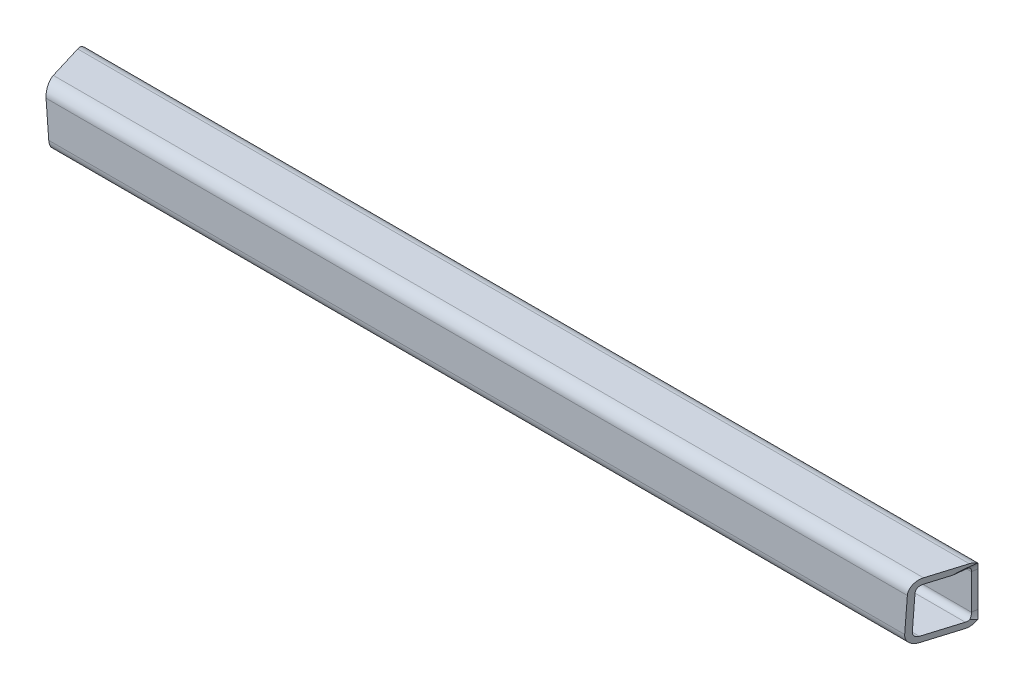
ISO-10303-21;
HEADER;
FILE_DESCRIPTION(('STEP AP214'),'2;1');
FILE_NAME('part.step','',(''),(''),'','','');
FILE_SCHEMA(('AUTOMOTIVE_DESIGN { 1 0 10303 214 1 1 1 1 }'));
ENDSEC;
DATA;
#1=APPLICATION_CONTEXT('core data for automotive mechanical design processes');
#2=APPLICATION_PROTOCOL_DEFINITION('international standard','automotive_design',2000,#1);
#3=PRODUCT_CONTEXT('',#1,'mechanical');
#4=PRODUCT('Part','Part','',(#3));
#5=PRODUCT_RELATED_PRODUCT_CATEGORY('part','',(#4));
#6=PRODUCT_DEFINITION_FORMATION('','',#4);
#7=PRODUCT_DEFINITION_CONTEXT('part definition',#1,'design');
#8=PRODUCT_DEFINITION('design','',#6,#7);
#9=PRODUCT_DEFINITION_SHAPE('','',#8);
#10=(LENGTH_UNIT() NAMED_UNIT(*) SI_UNIT(.MILLI.,.METRE.));
#11=(NAMED_UNIT(*) PLANE_ANGLE_UNIT() SI_UNIT($,.RADIAN.));
#12=(NAMED_UNIT(*) SI_UNIT($,.STERADIAN.) SOLID_ANGLE_UNIT());
#13=UNCERTAINTY_MEASURE_WITH_UNIT(LENGTH_MEASURE(1.E-05),#10,'distance_accuracy_value','');
#14=(GEOMETRIC_REPRESENTATION_CONTEXT(3) GLOBAL_UNCERTAINTY_ASSIGNED_CONTEXT((#13)) GLOBAL_UNIT_ASSIGNED_CONTEXT((#10,
#11,#12)) REPRESENTATION_CONTEXT('',''));
#15=CARTESIAN_POINT('',(0.,0.,0.));
#16=DIRECTION('',(0.,0.,1.));
#17=DIRECTION('',(1.,0.,0.));
#18=AXIS2_PLACEMENT_3D('',#15,#16,#17);
#19=CARTESIAN_POINT('',(-160.285714285715,6.00000000000003,-920.999999999999));
#20=DIRECTION('',(1.,0.,0.));
#21=DIRECTION('',(0.,1.,0.));
#22=AXIS2_PLACEMENT_3D('',#19,#20,#21);
#23=CYLINDRICAL_SURFACE('',#22,2.);
#24=DIRECTION('',(1.,0.,0.));
#25=VECTOR('',#24,1.);
#26=CARTESIAN_POINT('',(-160.285714285715,6.00000000000003,-922.999999999999));
#27=LINE('',#26,#25);
#28=CARTESIAN_POINT('',(-151.134905740681,6.00000000000001,-922.999999999999));
#29=VERTEX_POINT('',#28);
#30=CARTESIAN_POINT('',(151.13490574068,6.00000000000001,-922.999999999999));
#31=VERTEX_POINT('',#30);
#32=EDGE_CURVE('E226',#29,#31,#27,.T.);
#33=ORIENTED_EDGE('',*,*,#32,.T.);
#34=CARTESIAN_POINT('',(151.13490574068,6.00000000000001,-922.999999999999));
#35=CARTESIAN_POINT('',(151.134897059827,6.05419640564872,-923.00000751972));
#36=CARTESIAN_POINT('',(151.135762397031,6.10838772068273,-922.997797240482));
#37=CARTESIAN_POINT('',(151.139176480151,6.21634466272112,-922.988999579538));
#38=CARTESIAN_POINT('',(151.141724720267,6.27011041271801,-922.98241351298));
#39=CARTESIAN_POINT('',(151.148428023615,6.37664257140389,-922.964954042094));
#40=CARTESIAN_POINT('',(151.152577297065,6.42941187042656,-922.954096083372));
#41=CARTESIAN_POINT('',(151.162355513296,6.53376388752842,-922.928208961263));
#42=CARTESIAN_POINT('',(151.167984516834,6.58534655679074,-922.9131796266));
#43=CARTESIAN_POINT('',(151.186854651839,6.73771644841641,-922.862047647994));
#44=CARTESIAN_POINT('',(151.202090342615,6.83629511211455,-922.81987285929));
#45=CARTESIAN_POINT('',(151.236181038484,7.02499707587432,-922.720690858675));
#46=CARTESIAN_POINT('',(151.255039064201,7.1151132251054,-922.663671253645));
#47=CARTESIAN_POINT('',(151.295079291636,7.28857088229563,-922.533565402813));
#48=CARTESIAN_POINT('',(151.316326001025,7.3714658103511,-922.459902525123));
#49=CARTESIAN_POINT('',(151.357679010673,7.52413611556775,-922.299715109808));
#50=CARTESIAN_POINT('',(151.37778488278,7.59390658960106,-922.213185786973));
#51=CARTESIAN_POINT('',(151.41435947345,7.72046565481461,-922.026222269599));
#52=CARTESIAN_POINT('',(151.430694095417,7.77677758870827,-921.925436661786));
#53=CARTESIAN_POINT('',(151.455426889844,7.87139703455613,-921.714935880384));
#54=CARTESIAN_POINT('',(151.46383946791,7.90973716277423,-921.605237310595));
#55=CARTESIAN_POINT('',(151.469150778897,7.95877617584965,-921.412441799088));
#56=CARTESIAN_POINT('',(151.468635040142,7.97422767067173,-921.330606794626));
#57=CARTESIAN_POINT('',(151.463406923026,7.98969128993363,-921.207028806294));
#58=CARTESIAN_POINT('',(151.460915416117,7.99356021392647,-921.165642163092));
#59=CARTESIAN_POINT('',(151.454439009416,7.99871615520551,-921.082811844146));
#60=CARTESIAN_POINT('',(151.450453646466,8.00000237096007,-921.041368154691));
#61=CARTESIAN_POINT('',(151.445721087815,8.00000000000004,-920.999999999999));
#62=B_SPLINE_CURVE_WITH_KNOTS('',3,(#34,#35,#36,#37,#38,#39,#40,#41,#42,#43,#44,#45,#46,#47,#48,
#49,#50,#51,#52,#53,#54,#55,#56,#57,#58,#59,#60,#61),.UNSPECIFIED.,.F.,.F.,(4,2,2,2,2,2,2,2,2,2,
2,2,2,4),(0.,0.16252869645522,0.325008566785314,0.486906289594832,0.648810660860133,
0.972109124341931,1.29567836228111,1.63290689274576,1.97026115834366,2.31821291865465,
2.66553072757329,2.9145130908649,3.0393415756133,3.16420879432476),.UNSPECIFIED.);
#63=CARTESIAN_POINT('',(151.445721087815,8.00000000000004,-920.999999999999));
#64=VERTEX_POINT('',#63);
#65=EDGE_CURVE('E205',#31,#64,#62,.T.);
#66=ORIENTED_EDGE('',*,*,#65,.T.);
#67=DIRECTION('',(1.,0.,0.));
#68=VECTOR('',#67,1.);
#69=CARTESIAN_POINT('',(-160.285714285715,8.00000000000004,-920.999999999999));
#70=LINE('',#69,#68);
#71=CARTESIAN_POINT('',(-151.445721087815,8.00000000000004,-920.999999999999));
#72=VERTEX_POINT('',#71);
#73=EDGE_CURVE('E248',#72,#64,#70,.T.);
#74=ORIENTED_EDGE('',*,*,#73,.F.);
#75=CARTESIAN_POINT('',(-151.445721087815,8.00000000000004,-920.999999999999));
#76=CARTESIAN_POINT('',(-151.451517129834,8.00000903572294,-921.050589117872));
#77=CARTESIAN_POINT('',(-151.45618387766,7.99808071534614,-921.101305996992));
#78=CARTESIAN_POINT('',(-151.463283833278,7.99035879422783,-921.202585899075));
#79=CARTESIAN_POINT('',(-151.465717731673,7.98456638957483,-921.253148964786));
#80=CARTESIAN_POINT('',(-151.46837394052,7.96916428843077,-921.353492426546));
#81=CARTESIAN_POINT('',(-151.468607236734,7.95957380313401,-921.403275470431));
#82=CARTESIAN_POINT('',(-151.467019091782,7.93665621860682,-921.501927058206));
#83=CARTESIAN_POINT('',(-151.465197604561,7.92332903562757,-921.550795581575));
#84=CARTESIAN_POINT('',(-151.456913414074,7.87791364263258,-921.695428266285));
#85=CARTESIAN_POINT('',(-151.447634232296,7.84036617809091,-921.789383599776));
#86=CARTESIAN_POINT('',(-151.423542569026,7.75191664238408,-921.970020905703));
#87=CARTESIAN_POINT('',(-151.40872378646,7.70099938331442,-922.056694457378));
#88=CARTESIAN_POINT('',(-151.374955334016,7.58407292875091,-922.225481719183));
#89=CARTESIAN_POINT('',(-151.35582626498,7.51739897642207,-922.307098967391));
#90=CARTESIAN_POINT('',(-151.316561960971,7.37222994092314,-922.458772455435));
#91=CARTESIAN_POINT('',(-151.296426360285,7.29373053992197,-922.528824452782));
#92=CARTESIAN_POINT('',(-151.255880556745,7.11941127015457,-922.661288941842));
#93=CARTESIAN_POINT('',(-151.235590590544,7.0226887595338,-922.722557778644));
#94=CARTESIAN_POINT('',(-151.19926992651,6.81963269905309,-922.827914254527));
#95=CARTESIAN_POINT('',(-151.183235820798,6.71330693100691,-922.872015653719));
#96=CARTESIAN_POINT('',(-151.158965838382,6.50668154994383,-922.93742129344));
#97=CARTESIAN_POINT('',(-151.150040247101,6.40711762998516,-922.96077927195));
#98=CARTESIAN_POINT('',(-151.141012619842,6.25567479995235,-922.984252763148));
#99=CARTESIAN_POINT('',(-151.13873006506,6.20476261841694,-922.990150138339));
#100=CARTESIAN_POINT('',(-151.135674170797,6.10257436977137,-922.998025381361));
#101=CARTESIAN_POINT('',(-151.134901330089,6.05129818801775,-923.000001953857));
#102=CARTESIAN_POINT('',(-151.134905740681,6.00000000000001,-922.999999999999));
#103=B_SPLINE_CURVE_WITH_KNOTS('',3,(#75,#76,#77,#78,#79,#80,#81,#82,#83,#84,#85,#86,#87,#88,
#89,#90,#91,#92,#93,#94,#95,#96,#97,#98,#99,#100,#101,#102),.UNSPECIFIED.,.F.,.F.,(4,2,2,2,2,2,
2,2,2,2,2,2,2,4),(0.,0.152708033212283,0.305368819104958,0.45726709191222,0.609168769414979,
0.912480430850225,1.21613815216217,1.53613858551101,1.85625614523143,2.20338957179243,
2.55024418688331,2.85678919151711,3.01054619178082,3.16435398099613),.UNSPECIFIED.);
#104=EDGE_CURVE('E338',#72,#29,#103,.T.);
#105=ORIENTED_EDGE('',*,*,#104,.T.);
#106=EDGE_LOOP('',(#33,#66,#74,#105));
#107=FACE_BOUND('',#106,.T.);
#108=ADVANCED_FACE('F41',(#107),#23,.F.);
#109=CARTESIAN_POINT('',(-160.285714285715,6.00000000000003,-920.999999999999));
#110=DIRECTION('',(1.,0.,0.));
#111=DIRECTION('',(0.,1.,0.));
#112=AXIS2_PLACEMENT_3D('',#109,#110,#111);
#113=CYLINDRICAL_SURFACE('',#112,4.);
#114=CARTESIAN_POINT('',(154.932372015837,6.00000000000002,-920.999999999999));
#115=DIRECTION('',(0.74617243019316,0.,-0.665752735195008));
#116=DIRECTION('',(0.665752735195008,0.,0.74617243019316));
#117=AXIS2_PLACEMENT_3D('',#114,#115,#116);
#118=ELLIPSE('',#117,5.36069122650985,4.);
#119=CARTESIAN_POINT('',(151.363477169252,6.00000000000001,-924.999999999999));
#120=VERTEX_POINT('',#119);
#121=CARTESIAN_POINT('',(153.006385328775,9.36753446588342,-923.158636518982));
#122=VERTEX_POINT('',#121);
#123=EDGE_CURVE('E274',#120,#122,#118,.T.);
#124=ORIENTED_EDGE('',*,*,#123,.F.);
#125=DIRECTION('',(1.,0.,0.));
#126=VECTOR('',#125,1.);
#127=CARTESIAN_POINT('',(-160.285714285715,6.00000000000003,-924.999999999999));
#128=LINE('',#127,#126);
#129=CARTESIAN_POINT('',(-151.363477169252,6.00000000000001,-925.));
#130=VERTEX_POINT('',#129);
#131=EDGE_CURVE('E204',#130,#120,#128,.T.);
#132=ORIENTED_EDGE('',*,*,#131,.F.);
#133=CARTESIAN_POINT('',(-154.932372015837,6.00000000000002,-920.999999999999));
#134=DIRECTION('',(0.74617243019316,0.,0.665752735195008));
#135=DIRECTION('',(0.665752735195008,0.,-0.74617243019316));
#136=AXIS2_PLACEMENT_3D('',#133,#134,#135);
#137=ELLIPSE('',#136,5.36069122650985,4.);
#138=CARTESIAN_POINT('',(-153.006385328775,9.36753446588327,-923.158636518983));
#139=VERTEX_POINT('',#138);
#140=EDGE_CURVE('E345',#139,#130,#137,.F.);
#141=ORIENTED_EDGE('',*,*,#140,.F.);
#142=CARTESIAN_POINT('',(-152.091058034834,6.00000000000003,-920.999999999999));
#143=DIRECTION('',(-0.954065398667244,-0.0730777748475656,0.29054922799629));
#144=DIRECTION('',(0.299598423003046,-0.232714764299507,0.925248411731203));
#145=AXIS2_PLACEMENT_3D('',#142,#143,#144);
#146=ELLIPSE('',#145,4.19258470707322,4.);
#147=CARTESIAN_POINT('',(-152.397442796087,10.,-920.999999999999));
#148=VERTEX_POINT('',#147);
#149=EDGE_CURVE('E230',#148,#139,#146,.T.);
#150=ORIENTED_EDGE('',*,*,#149,.F.);
#151=DIRECTION('',(1.,0.,0.));
#152=VECTOR('',#151,1.);
#153=CARTESIAN_POINT('',(-160.285714285715,10.,-920.999999999999));
#154=LINE('',#153,#152);
#155=CARTESIAN_POINT('',(152.397442796087,10.,-920.999999999999));
#156=VERTEX_POINT('',#155);
#157=EDGE_CURVE('E213',#148,#156,#154,.T.);
#158=ORIENTED_EDGE('',*,*,#157,.T.);
#159=CARTESIAN_POINT('',(152.091058034834,6.00000000000003,-920.999999999999));
#160=DIRECTION('',(0.954065398667245,-0.0730777748475653,0.290549227996289));
#161=DIRECTION('',(0.299598423003044,0.232714764299507,-0.925248411731203));
#162=AXIS2_PLACEMENT_3D('',#159,#160,#161);
#163=ELLIPSE('',#162,4.19258470707322,4.);
#164=EDGE_CURVE('E283',#122,#156,#163,.T.);
#165=ORIENTED_EDGE('',*,*,#164,.F.);
#166=EDGE_LOOP('',(#124,#132,#141,#150,#158,#165));
#167=FACE_BOUND('',#166,.T.);
#168=ADVANCED_FACE('F425',(#167),#113,.T.);
#169=CARTESIAN_POINT('',(-160.285714285715,-5.99999999999998,-920.999999999999));
#170=DIRECTION('',(1.,0.,0.));
#171=DIRECTION('',(0.,1.,0.));
#172=AXIS2_PLACEMENT_3D('',#169,#170,#171);
#173=CYLINDRICAL_SURFACE('',#172,4.);
#174=CARTESIAN_POINT('',(154.932372015837,-5.99999999999999,-920.999999999999));
#175=DIRECTION('',(0.74617243019316,0.,-0.665752735195008));
#176=DIRECTION('',(0.665752735195008,0.,0.74617243019316));
#177=AXIS2_PLACEMENT_3D('',#174,#175,#176);
#178=ELLIPSE('',#177,5.36069122650985,4.);
#179=CARTESIAN_POINT('',(151.998741926291,-8.27795234068853,-924.287998347558));
#180=VERTEX_POINT('',#179);
#181=CARTESIAN_POINT('',(151.363477169252,-6.00000000000001,-924.999999999999));
#182=VERTEX_POINT('',#181);
#183=EDGE_CURVE('E178',#180,#182,#178,.T.);
#184=ORIENTED_EDGE('',*,*,#183,.F.);
#185=CARTESIAN_POINT('',(151.171903751076,-5.99999999999998,-920.999999999999));
#186=DIRECTION('',(0.954065398667245,-0.0730777748475653,0.290549227996289));
#187=DIRECTION('',(0.299598423003044,0.232714764299507,-0.925248411731203));
#188=AXIS2_PLACEMENT_3D('',#185,#186,#187);
#189=ELLIPSE('',#188,4.19258470707322,4.);
#190=CARTESIAN_POINT('',(150.865518989823,-9.99999999999998,-920.999999999999));
#191=VERTEX_POINT('',#190);
#192=EDGE_CURVE('E263',#191,#180,#189,.T.);
#193=ORIENTED_EDGE('',*,*,#192,.F.);
#194=DIRECTION('',(1.,0.,0.));
#195=VECTOR('',#194,1.);
#196=CARTESIAN_POINT('',(-160.285714285715,-9.99999999999998,-920.999999999999));
#197=LINE('',#196,#195);
#198=CARTESIAN_POINT('',(-150.865518989823,-9.99999999999998,-920.999999999999));
#199=VERTEX_POINT('',#198);
#200=EDGE_CURVE('E211',#199,#191,#197,.T.);
#201=ORIENTED_EDGE('',*,*,#200,.F.);
#202=CARTESIAN_POINT('',(-151.171903751076,-5.99999999999998,-920.999999999999));
#203=DIRECTION('',(-0.954065398667244,-0.0730777748475656,0.29054922799629));
#204=DIRECTION('',(0.299598423003046,-0.232714764299507,0.925248411731203));
#205=AXIS2_PLACEMENT_3D('',#202,#203,#204);
#206=ELLIPSE('',#205,4.19258470707322,4.);
#207=CARTESIAN_POINT('',(-151.998741926291,-8.27795234068825,-924.287998347559));
#208=VERTEX_POINT('',#207);
#209=EDGE_CURVE('E365',#208,#199,#206,.T.);
#210=ORIENTED_EDGE('',*,*,#209,.F.);
#211=CARTESIAN_POINT('',(-154.932372015837,-5.99999999999999,-920.999999999999));
#212=DIRECTION('',(0.74617243019316,0.,0.665752735195008));
#213=DIRECTION('',(0.665752735195008,0.,-0.74617243019316));
#214=AXIS2_PLACEMENT_3D('',#211,#212,#213);
#215=ELLIPSE('',#214,5.36069122650985,4.);
#216=CARTESIAN_POINT('',(-151.363477169252,-6.00000000000001,-924.999999999999));
#217=VERTEX_POINT('',#216);
#218=EDGE_CURVE('E210',#217,#208,#215,.F.);
#219=ORIENTED_EDGE('',*,*,#218,.F.);
#220=DIRECTION('',(1.,0.,0.));
#221=VECTOR('',#220,1.);
#222=CARTESIAN_POINT('',(-160.285714285715,-5.99999999999998,-924.999999999999));
#223=LINE('',#222,#221);
#224=EDGE_CURVE('E202',#217,#182,#223,.T.);
#225=ORIENTED_EDGE('',*,*,#224,.T.);
#226=EDGE_LOOP('',(#184,#193,#201,#210,#219,#225));
#227=FACE_BOUND('',#226,.T.);
#228=ADVANCED_FACE('F208',(#227),#173,.T.);
#229=CARTESIAN_POINT('',(-160.285714285715,8.00000000000004,-908.999999999999));
#230=DIRECTION('',(0.,-1.,0.));
#231=DIRECTION('',(1.,0.,0.));
#232=AXIS2_PLACEMENT_3D('',#229,#230,#231);
#233=PLANE('',#232);
#234=ORIENTED_EDGE('',*,*,#73,.T.);
#235=DIRECTION('',(-0.113546591160732,0.,0.993532672656404));
#236=VECTOR('',#235,1.);
#237=CARTESIAN_POINT('',(240.59710582802,8.00000000000004,-1701.0746164768));
#238=LINE('',#237,#236);
#239=CARTESIAN_POINT('',(150.966039783215,8.00000000000004,-916.802788584759));
#240=VERTEX_POINT('',#239);
#241=EDGE_CURVE('E11',#64,#240,#238,.T.);
#242=ORIENTED_EDGE('',*,*,#241,.T.);
#243=DIRECTION('',(-0.291328168163365,0.,0.956623174732129));
#244=VECTOR('',#243,1.);
#245=CARTESIAN_POINT('',(122.374880183697,8.00000000000004,-822.919090218778));
#246=LINE('',#245,#244);
#247=CARTESIAN_POINT('',(148.589793665613,8.00000000000004,-908.999999999999));
#248=VERTEX_POINT('',#247);
#249=EDGE_CURVE('E270',#240,#248,#246,.T.);
#250=ORIENTED_EDGE('',*,*,#249,.T.);
#251=DIRECTION('',(1.,0.,0.));
#252=VECTOR('',#251,1.);
#253=CARTESIAN_POINT('',(-160.285714285715,8.00000000000004,-908.999999999999));
#254=LINE('',#253,#252);
#255=CARTESIAN_POINT('',(-148.589793665613,8.00000000000004,-908.999999999999));
#256=VERTEX_POINT('',#255);
#257=EDGE_CURVE('E245',#256,#248,#254,.T.);
#258=ORIENTED_EDGE('',*,*,#257,.F.);
#259=DIRECTION('',(-0.291328168163367,0.,-0.956623174732129));
#260=VECTOR('',#259,1.);
#261=CARTESIAN_POINT('',(-149.582451028384,8.00000000000004,-912.259551054678));
#262=LINE('',#261,#260);
#263=CARTESIAN_POINT('',(-150.966039783218,8.00000000000004,-916.802788584771));
#264=VERTEX_POINT('',#263);
#265=EDGE_CURVE('E357',#256,#264,#262,.T.);
#266=ORIENTED_EDGE('',*,*,#265,.T.);
#267=DIRECTION('',(0.113546591160732,0.,0.993532672656404));
#268=VECTOR('',#267,1.);
#269=CARTESIAN_POINT('',(-240.597105828021,8.00000000000004,-1701.0746164768));
#270=LINE('',#269,#268);
#271=EDGE_CURVE('E314',#264,#72,#270,.F.);
#272=ORIENTED_EDGE('',*,*,#271,.T.);
#273=EDGE_LOOP('',(#234,#242,#250,#258,#266,#272));
#274=FACE_BOUND('',#273,.T.);
#275=ADVANCED_FACE('F419',(#274),#233,.T.);
#276=CARTESIAN_POINT('',(-160.285714285715,-5.99999999999998,-920.999999999999));
#277=DIRECTION('',(1.,0.,0.));
#278=DIRECTION('',(0.,1.,0.));
#279=AXIS2_PLACEMENT_3D('',#276,#277,#278);
#280=CYLINDRICAL_SURFACE('',#279,2.);
#281=CARTESIAN_POINT('',(151.171903751076,-5.99999999999998,-920.999999999999));
#282=DIRECTION('',(0.954065398667245,-0.0730777748475653,0.290549227996289));
#283=DIRECTION('',(0.299598423003044,0.232714764299507,-0.925248411731203));
#284=AXIS2_PLACEMENT_3D('',#281,#282,#283);
#285=ELLIPSE('',#284,2.09629235353661,2.);
#286=CARTESIAN_POINT('',(151.018711370449,-7.99999999999998,-920.999999999999));
#287=VERTEX_POINT('',#286);
#288=CARTESIAN_POINT('',(151.392469811754,-7.64471841513553,-922.137937315897));
#289=VERTEX_POINT('',#288);
#290=EDGE_CURVE('E262',#287,#289,#285,.T.);
#291=ORIENTED_EDGE('',*,*,#290,.T.);
#292=CARTESIAN_POINT('',(151.445721087815,-7.99999999999998,-920.999999999999));
#293=CARTESIAN_POINT('',(151.451517129834,-8.00000903572288,-921.050589117872));
#294=CARTESIAN_POINT('',(151.456183877659,-7.99808071534609,-921.101305996992));
#295=CARTESIAN_POINT('',(151.463283833277,-7.99035879422777,-921.202585899075));
#296=CARTESIAN_POINT('',(151.465717731673,-7.98456638957477,-921.253148964786));
#297=CARTESIAN_POINT('',(151.46837394052,-7.9691642884307,-921.353492426546));
#298=CARTESIAN_POINT('',(151.468607236733,-7.95957380313394,-921.403275470431));
#299=CARTESIAN_POINT('',(151.467019091782,-7.93665621860676,-921.501927058206));
#300=CARTESIAN_POINT('',(151.465197604561,-7.92332903562752,-921.550795581575));
#301=CARTESIAN_POINT('',(151.456913414074,-7.87791364263253,-921.695428266285));
#302=CARTESIAN_POINT('',(151.447634232296,-7.84036617809086,-921.789383599776));
#303=CARTESIAN_POINT('',(151.423542569026,-7.75191664238402,-921.970020905703));
#304=CARTESIAN_POINT('',(151.408723786459,-7.70099938331436,-922.056694457378));
#305=CARTESIAN_POINT('',(151.374955334015,-7.58407292875085,-922.225481719183));
#306=CARTESIAN_POINT('',(151.355826264979,-7.51739897642201,-922.307098967391));
#307=CARTESIAN_POINT('',(151.316561960971,-7.37222994092308,-922.458772455435));
#308=CARTESIAN_POINT('',(151.296426360284,-7.29373053992191,-922.528824452782));
#309=CARTESIAN_POINT('',(151.255880556745,-7.11941127015451,-922.661288941842));
#310=CARTESIAN_POINT('',(151.235590590544,-7.02268875953375,-922.722557778644));
#311=CARTESIAN_POINT('',(151.19926992651,-6.81963269905303,-922.827914254527));
#312=CARTESIAN_POINT('',(151.183235820797,-6.71330693100685,-922.872015653719));
#313=CARTESIAN_POINT('',(151.158965838382,-6.50668154994377,-922.93742129344));
#314=CARTESIAN_POINT('',(151.150040247101,-6.4071176299851,-922.96077927195));
#315=CARTESIAN_POINT('',(151.141012619842,-6.25567479995229,-922.984252763148));
#316=CARTESIAN_POINT('',(151.13873006506,-6.20476261841688,-922.990150138339));
#317=CARTESIAN_POINT('',(151.135674170797,-6.10257436977131,-922.998025381361));
#318=CARTESIAN_POINT('',(151.134901330089,-6.05129818801769,-923.000001953857));
#319=CARTESIAN_POINT('',(151.13490574068,-5.99999999999995,-922.999999999999));
#320=B_SPLINE_CURVE_WITH_KNOTS('',3,(#292,#293,#294,#295,#296,#297,#298,#299,#300,#301,#302,
#303,#304,#305,#306,#307,#308,#309,#310,#311,#312,#313,#314,#315,#316,#317,#318,#319),
.UNSPECIFIED.,.F.,.F.,(4,2,2,2,2,2,2,2,2,2,2,2,2,4),(0.,0.152708033212293,0.305368819105079,
0.457267091912229,0.609168769414989,0.912480430850233,1.21613815216217,1.53613858551102,
1.85625614523143,2.20338957179243,2.55024418688331,2.85678919151712,3.01054619178083,
3.16435398099614),.UNSPECIFIED.);
#321=CARTESIAN_POINT('',(151.13490574068,-6.00000000000001,-922.999999999999));
#322=VERTEX_POINT('',#321);
#323=EDGE_CURVE('E56',#289,#322,#320,.T.);
#324=ORIENTED_EDGE('',*,*,#323,.T.);
#325=DIRECTION('',(1.,0.,0.));
#326=VECTOR('',#325,1.);
#327=CARTESIAN_POINT('',(-160.285714285715,-5.99999999999998,-922.999999999999));
#328=LINE('',#327,#326);
#329=CARTESIAN_POINT('',(-151.134905740681,-6.00000000000001,-922.999999999999));
#330=VERTEX_POINT('',#329);
#331=EDGE_CURVE('E229',#330,#322,#328,.T.);
#332=ORIENTED_EDGE('',*,*,#331,.F.);
#333=CARTESIAN_POINT('',(-151.134905740681,-5.99999999999998,-922.999999999999));
#334=CARTESIAN_POINT('',(-151.134897059827,-6.05419640564869,-923.00000751972));
#335=CARTESIAN_POINT('',(-151.135762397032,-6.1083877206827,-922.997797240482));
#336=CARTESIAN_POINT('',(-151.139176480152,-6.2163446627211,-922.988999579538));
#337=CARTESIAN_POINT('',(-151.141724720267,-6.270110412718,-922.98241351298));
#338=CARTESIAN_POINT('',(-151.148428023615,-6.37664257140387,-922.964954042094));
#339=CARTESIAN_POINT('',(-151.152577297065,-6.42941187042655,-922.954096083372));
#340=CARTESIAN_POINT('',(-151.162355513296,-6.5337638875284,-922.928208961263));
#341=CARTESIAN_POINT('',(-151.167984516834,-6.58534655679071,-922.9131796266));
#342=CARTESIAN_POINT('',(-151.18685465184,-6.73771644841637,-922.862047647994));
#343=CARTESIAN_POINT('',(-151.202090342615,-6.83629511211451,-922.81987285929));
#344=CARTESIAN_POINT('',(-151.236181038485,-7.02499707587428,-922.720690858675));
#345=CARTESIAN_POINT('',(-151.255039064202,-7.11511322510535,-922.663671253645));
#346=CARTESIAN_POINT('',(-151.295079291636,-7.28857088229559,-922.533565402813));
#347=CARTESIAN_POINT('',(-151.316326001025,-7.37146581035107,-922.459902525123));
#348=CARTESIAN_POINT('',(-151.357679010673,-7.52413611556771,-922.299715109808));
#349=CARTESIAN_POINT('',(-151.37778488278,-7.59390658960101,-922.213185786973));
#350=CARTESIAN_POINT('',(-151.414359473451,-7.72046565481455,-922.026222269599));
#351=CARTESIAN_POINT('',(-151.430694095418,-7.77677758870823,-921.925436661786));
#352=CARTESIAN_POINT('',(-151.455426889844,-7.87139703455608,-921.714935880384));
#353=CARTESIAN_POINT('',(-151.463839467911,-7.90973716277417,-921.605237310595));
#354=CARTESIAN_POINT('',(-151.469150778897,-7.95877617584959,-921.412441799088));
#355=CARTESIAN_POINT('',(-151.468635040142,-7.97422767067167,-921.330606794626));
#356=CARTESIAN_POINT('',(-151.463406923026,-7.98969128993358,-921.207028806294));
#357=CARTESIAN_POINT('',(-151.460915416118,-7.99356021392642,-921.165642163092));
#358=CARTESIAN_POINT('',(-151.454439009416,-7.99871615520545,-921.082811844146));
#359=CARTESIAN_POINT('',(-151.450453646466,-8.00000237096001,-921.041368154691));
#360=CARTESIAN_POINT('',(-151.445721087815,-7.99999999999998,-920.999999999999));
#361=B_SPLINE_CURVE_WITH_KNOTS('',3,(#333,#334,#335,#336,#337,#338,#339,#340,#341,#342,#343,
#344,#345,#346,#347,#348,#349,#350,#351,#352,#353,#354,#355,#356,#357,#358,#359,#360),
.UNSPECIFIED.,.F.,.F.,(4,2,2,2,2,2,2,2,2,2,2,2,2,4),(0.,0.162528696455236,0.325008566785325,
0.486906289594831,0.648810660860126,0.972109124341905,1.29567836228109,1.63290689274575,
1.97026115834364,2.31821291865462,2.66553072757326,2.91451309086487,3.03934157561339,
3.16420879432473),.UNSPECIFIED.);
#362=CARTESIAN_POINT('',(-151.392469811754,-7.64471841513518,-922.137937315898));
#363=VERTEX_POINT('',#362);
#364=EDGE_CURVE('E305',#330,#363,#361,.T.);
#365=ORIENTED_EDGE('',*,*,#364,.T.);
#366=CARTESIAN_POINT('',(-151.171903751076,-5.99999999999998,-920.999999999999));
#367=DIRECTION('',(-0.954065398667244,-0.0730777748475656,0.29054922799629));
#368=DIRECTION('',(0.299598423003046,-0.232714764299507,0.925248411731203));
#369=AXIS2_PLACEMENT_3D('',#366,#367,#368);
#370=ELLIPSE('',#369,2.09629235353661,2.);
#371=CARTESIAN_POINT('',(-151.018711370449,-7.99999999999998,-920.999999999999));
#372=VERTEX_POINT('',#371);
#373=EDGE_CURVE('E352',#363,#372,#370,.T.);
#374=ORIENTED_EDGE('',*,*,#373,.T.);
#375=DIRECTION('',(1.,0.,0.));
#376=VECTOR('',#375,1.);
#377=CARTESIAN_POINT('',(-160.285714285715,-7.99999999999998,-920.999999999999));
#378=LINE('',#377,#376);
#379=EDGE_CURVE('E233',#372,#287,#378,.T.);
#380=ORIENTED_EDGE('',*,*,#379,.T.);
#381=EDGE_LOOP('',(#291,#324,#332,#365,#374,#380));
#382=FACE_BOUND('',#381,.T.);
#383=ADVANCED_FACE('F265',(#382),#280,.F.);
#384=CARTESIAN_POINT('',(-244.038803964062,-6.00000000000001,-1700.68127954697));
#385=DIRECTION('',(0.113546591160732,0.,0.993532672656404));
#386=DIRECTION('',(0.993532672656404,0.,-0.113546591160732));
#387=AXIS2_PLACEMENT_3D('',#384,#385,#386);
#388=CYLINDRICAL_SURFACE('',#387,4.);
#389=DIRECTION('',(0.113546591160732,0.,0.993532672656404));
#390=VECTOR('',#389,1.);
#391=CARTESIAN_POINT('',(-240.064673273436,-6.00000000000001,-1701.13546591161));
#392=LINE('',#391,#390);
#393=EDGE_CURVE('E298',#217,#330,#392,.T.);
#394=ORIENTED_EDGE('',*,*,#393,.F.);
#395=ORIENTED_EDGE('',*,*,#218,.T.);
#396=CARTESIAN_POINT('',(-157.191307612425,-6.00000000000001,-940.765686470145));
#397=DIRECTION('',(-0.954065398667244,-0.0730777748475656,0.29054922799629));
#398=DIRECTION('',(0.290362707329467,0.0133984681433684,0.956822856773245));
#399=AXIS2_PLACEMENT_3D('',#396,#397,#398);
#400=ELLIPSE('',#399,22.1804149414023,4.);
#401=EDGE_CURVE('E253',#363,#208,#400,.F.);
#402=ORIENTED_EDGE('',*,*,#401,.F.);
#403=ORIENTED_EDGE('',*,*,#364,.F.);
#404=EDGE_LOOP('',(#394,#395,#402,#403));
#405=FACE_BOUND('',#404,.T.);
#406=ADVANCED_FACE('F319',(#405),#388,.F.);
#407=CARTESIAN_POINT('',(-100.020879364242,-73.9667828296152,-770.132067830907));
#408=DIRECTION('',(-0.954065398667244,-0.0730777748475656,0.29054922799629));
#409=DIRECTION('',(0.291328168163367,0.,0.956623174732129));
#410=AXIS2_PLACEMENT_3D('',#407,#408,#409);
#411=PLANE('',#410);
#412=ORIENTED_EDGE('',*,*,#149,.T.);
#413=CARTESIAN_POINT('',(-156.639166181052,6.00000000000001,-935.93444894563));
#414=DIRECTION('',(-0.954065398667244,-0.0730777748475656,0.29054922799629));
#415=DIRECTION('',(0.290362707329467,0.0133984681433684,0.956822856773245));
#416=AXIS2_PLACEMENT_3D('',#413,#414,#415);
#417=ELLIPSE('',#416,22.1804149414023,4.);
#418=EDGE_CURVE('E256',#139,#264,#417,.F.);
#419=ORIENTED_EDGE('',*,*,#418,.T.);
#420=ORIENTED_EDGE('',*,*,#265,.F.);
#421=CARTESIAN_POINT('',(-148.436601284987,6.00000000000003,-908.999999999999));
#422=DIRECTION('',(-0.954065398667244,-0.0730777748475656,0.29054922799629));
#423=DIRECTION('',(0.299598423003046,-0.232714764299507,0.925248411731203));
#424=AXIS2_PLACEMENT_3D('',#421,#422,#423);
#425=ELLIPSE('',#424,2.09629235353661,2.);
#426=CARTESIAN_POINT('',(-147.827525160012,6.00000000000003,-906.999999999999));
#427=VERTEX_POINT('',#426);
#428=EDGE_CURVE('E354',#427,#256,#425,.T.);
#429=ORIENTED_EDGE('',*,*,#428,.F.);
#430=DIRECTION('',(-0.0763724801905252,0.997079357057174,0.));
#431=VECTOR('',#430,1.);
#432=CARTESIAN_POINT('',(-147.900190734026,6.94868391909392,-906.999999999999));
#433=LINE('',#432,#431);
#434=CARTESIAN_POINT('',(-146.908370876254,-5.99999999999998,-906.999999999999));
#435=VERTEX_POINT('',#434);
#436=EDGE_CURVE('E378',#435,#427,#433,.T.);
#437=ORIENTED_EDGE('',*,*,#436,.F.);
#438=CARTESIAN_POINT('',(-147.517447001228,-5.99999999999998,-908.999999999999));
#439=DIRECTION('',(-0.954065398667244,-0.0730777748475656,0.29054922799629));
#440=DIRECTION('',(0.299598423003046,-0.232714764299507,0.925248411731203));
#441=AXIS2_PLACEMENT_3D('',#438,#439,#440);
#442=ELLIPSE('',#441,2.09629235353661,2.);
#443=CARTESIAN_POINT('',(-147.364254620602,-7.99999999999998,-908.999999999999));
#444=VERTEX_POINT('',#443);
#445=EDGE_CURVE('E375',#444,#435,#442,.T.);
#446=ORIENTED_EDGE('',*,*,#445,.F.);
#447=DIRECTION('',(0.291328168163367,0.,0.956623174732129));
#448=VECTOR('',#447,1.);
#449=CARTESIAN_POINT('',(-151.805221383081,-7.99999999999998,-923.582632877505));
#450=LINE('',#449,#448);
#451=EDGE_CURVE('E372',#372,#444,#450,.T.);
#452=ORIENTED_EDGE('',*,*,#451,.F.);
#453=ORIENTED_EDGE('',*,*,#373,.F.);
#454=ORIENTED_EDGE('',*,*,#401,.T.);
#455=ORIENTED_EDGE('',*,*,#209,.T.);
#456=DIRECTION('',(0.291328168163367,0.,0.956623174732129));
#457=VECTOR('',#456,1.);
#458=CARTESIAN_POINT('',(-151.665030761742,-9.99999999999998,-923.625326257706));
#459=LINE('',#458,#457);
#460=CARTESIAN_POINT('',(-147.211062239975,-9.99999999999998,-908.999999999999));
#461=VERTEX_POINT('',#460);
#462=EDGE_CURVE('E370',#199,#461,#459,.T.);
#463=ORIENTED_EDGE('',*,*,#462,.T.);
#464=CARTESIAN_POINT('',(-147.517447001228,-5.99999999999998,-908.999999999999));
#465=DIRECTION('',(-0.954065398667244,-0.0730777748475656,0.29054922799629));
#466=DIRECTION('',(0.299598423003046,-0.232714764299507,0.925248411731203));
#467=AXIS2_PLACEMENT_3D('',#464,#465,#466);
#468=ELLIPSE('',#467,4.19258470707322,4.);
#469=CARTESIAN_POINT('',(-146.299294751279,-5.99999999999998,-904.999999999999));
#470=VERTEX_POINT('',#469);
#471=EDGE_CURVE('E368',#461,#470,#468,.T.);
#472=ORIENTED_EDGE('',*,*,#471,.T.);
#473=DIRECTION('',(-0.0763724801905252,0.997079357057174,0.));
#474=VECTOR('',#473,1.);
#475=CARTESIAN_POINT('',(-147.29466720131,6.99506471484499,-904.999999999999));
#476=LINE('',#475,#474);
#477=CARTESIAN_POINT('',(-147.218449035038,6.00000000000003,-904.999999999999));
#478=VERTEX_POINT('',#477);
#479=EDGE_CURVE('E225',#470,#478,#476,.T.);
#480=ORIENTED_EDGE('',*,*,#479,.T.);
#481=CARTESIAN_POINT('',(-148.436601284987,6.00000000000003,-908.999999999999));
#482=DIRECTION('',(-0.954065398667244,-0.0730777748475656,0.29054922799629));
#483=DIRECTION('',(0.299598423003046,-0.232714764299507,0.925248411731203));
#484=AXIS2_PLACEMENT_3D('',#481,#482,#483);
#485=ELLIPSE('',#484,4.19258470707322,4.);
#486=CARTESIAN_POINT('',(-148.74298604624,10.,-908.999999999999));
#487=VERTEX_POINT('',#486);
#488=EDGE_CURVE('E360',#478,#487,#485,.T.);
#489=ORIENTED_EDGE('',*,*,#488,.T.);
#490=DIRECTION('',(-0.291328168163367,0.,-0.956623174732129));
#491=VECTOR('',#490,1.);
#492=CARTESIAN_POINT('',(-149.722641649722,10.,-912.216857674477));
#493=LINE('',#492,#491);
#494=EDGE_CURVE('E362',#487,#148,#493,.T.);
#495=ORIENTED_EDGE('',*,*,#494,.T.);
#496=EDGE_LOOP('',(#412,#419,#420,#429,#437,#446,#452,#453,#454,#455,#463,#472,#480,#489,#495));
#497=FACE_BOUND('',#496,.T.);
#498=ADVANCED_FACE('F324',(#497),#411,.T.);
#499=CARTESIAN_POINT('',(-244.038803964062,6.00000000000001,-1700.68127954697));
#500=DIRECTION('',(0.113546591160732,0.,0.993532672656404));
#501=DIRECTION('',(0.993532672656404,0.,-0.113546591160732));
#502=AXIS2_PLACEMENT_3D('',#499,#500,#501);
#503=CYLINDRICAL_SURFACE('',#502,4.);
#504=ORIENTED_EDGE('',*,*,#140,.T.);
#505=DIRECTION('',(0.113546591160732,0.,0.993532672656404));
#506=VECTOR('',#505,1.);
#507=CARTESIAN_POINT('',(-240.064673273436,6.00000000000001,-1701.13546591161));
#508=LINE('',#507,#506);
#509=EDGE_CURVE('E301',#130,#29,#508,.T.);
#510=ORIENTED_EDGE('',*,*,#509,.T.);
#511=ORIENTED_EDGE('',*,*,#104,.F.);
#512=ORIENTED_EDGE('',*,*,#271,.F.);
#513=ORIENTED_EDGE('',*,*,#418,.F.);
#514=EDGE_LOOP('',(#504,#510,#511,#512,#513));
#515=FACE_BOUND('',#514,.T.);
#516=ADVANCED_FACE('F331',(#515),#503,.F.);
#517=CARTESIAN_POINT('',(-240.064673273436,-6.00000000000001,-1701.13546591161));
#518=DIRECTION('',(-0.993532672656404,0.,0.113546591160732));
#519=DIRECTION('',(0.113546591160732,0.,0.993532672656404));
#520=AXIS2_PLACEMENT_3D('',#517,#518,#519);
#521=PLANE('',#520);
#522=ORIENTED_EDGE('',*,*,#509,.F.);
#523=DIRECTION('',(0.,-1.,0.));
#524=VECTOR('',#523,1.);
#525=CARTESIAN_POINT('',(-151.363477169252,-5.99999999999998,-924.999999999999));
#526=LINE('',#525,#524);
#527=EDGE_CURVE('E347',#130,#217,#526,.T.);
#528=ORIENTED_EDGE('',*,*,#527,.T.);
#529=ORIENTED_EDGE('',*,*,#393,.T.);
#530=DIRECTION('',(0.,-1.,0.));
#531=VECTOR('',#530,1.);
#532=CARTESIAN_POINT('',(-151.134905740681,-5.99999999999998,-922.999999999999));
#533=LINE('',#532,#531);
#534=EDGE_CURVE('E349',#29,#330,#533,.T.);
#535=ORIENTED_EDGE('',*,*,#534,.F.);
#536=EDGE_LOOP('',(#522,#528,#529,#535));
#537=FACE_BOUND('',#536,.T.);
#538=ADVANCED_FACE('F327',(#537),#521,.T.);
#539=CARTESIAN_POINT('',(-160.285714285715,-5.99999999999998,-908.999999999999));
#540=DIRECTION('',(1.,0.,0.));
#541=DIRECTION('',(0.,1.,0.));
#542=AXIS2_PLACEMENT_3D('',#539,#540,#541);
#543=CYLINDRICAL_SURFACE('',#542,4.);
#544=CARTESIAN_POINT('',(147.517447001228,-5.99999999999998,-908.999999999999));
#545=DIRECTION('',(0.954065398667245,-0.0730777748475653,0.290549227996289));
#546=DIRECTION('',(0.299598423003044,0.232714764299507,-0.925248411731203));
#547=AXIS2_PLACEMENT_3D('',#544,#545,#546);
#548=ELLIPSE('',#547,4.19258470707322,4.);
#549=CARTESIAN_POINT('',(146.299294751279,-5.99999999999998,-904.999999999999));
#550=VERTEX_POINT('',#549);
#551=CARTESIAN_POINT('',(147.211062239975,-9.99999999999998,-908.999999999999));
#552=VERTEX_POINT('',#551);
#553=EDGE_CURVE('E294',#550,#552,#548,.T.);
#554=ORIENTED_EDGE('',*,*,#553,.F.);
#555=DIRECTION('',(1.,0.,0.));
#556=VECTOR('',#555,1.);
#557=CARTESIAN_POINT('',(-160.285714285715,-5.99999999999998,-904.999999999999));
#558=LINE('',#557,#556);
#559=EDGE_CURVE('E384',#470,#550,#558,.T.);
#560=ORIENTED_EDGE('',*,*,#559,.F.);
#561=ORIENTED_EDGE('',*,*,#471,.F.);
#562=DIRECTION('',(1.,0.,0.));
#563=VECTOR('',#562,1.);
#564=CARTESIAN_POINT('',(-160.285714285715,-9.99999999999998,-908.999999999999));
#565=LINE('',#564,#563);
#566=EDGE_CURVE('E216',#461,#552,#565,.T.);
#567=ORIENTED_EDGE('',*,*,#566,.T.);
#568=EDGE_LOOP('',(#554,#560,#561,#567));
#569=FACE_BOUND('',#568,.T.);
#570=ADVANCED_FACE('F330',(#569),#543,.T.);
#571=CARTESIAN_POINT('',(-160.285714285715,-5.99999999999998,-908.999999999999));
#572=DIRECTION('',(1.,0.,0.));
#573=DIRECTION('',(0.,1.,0.));
#574=AXIS2_PLACEMENT_3D('',#571,#572,#573);
#575=CYLINDRICAL_SURFACE('',#574,2.);
#576=DIRECTION('',(1.,0.,0.));
#577=VECTOR('',#576,1.);
#578=CARTESIAN_POINT('',(-160.285714285715,-5.99999999999998,-906.999999999999));
#579=LINE('',#578,#577);
#580=CARTESIAN_POINT('',(146.908370876254,-5.99999999999998,-906.999999999999));
#581=VERTEX_POINT('',#580);
#582=EDGE_CURVE('E239',#435,#581,#579,.T.);
#583=ORIENTED_EDGE('',*,*,#582,.T.);
#584=CARTESIAN_POINT('',(147.517447001228,-5.99999999999998,-908.999999999999));
#585=DIRECTION('',(0.954065398667245,-0.0730777748475653,0.290549227996289));
#586=DIRECTION('',(0.299598423003044,0.232714764299507,-0.925248411731203));
#587=AXIS2_PLACEMENT_3D('',#584,#585,#586);
#588=ELLIPSE('',#587,2.09629235353661,2.);
#589=CARTESIAN_POINT('',(147.364254620602,-7.99999999999998,-908.999999999999));
#590=VERTEX_POINT('',#589);
#591=EDGE_CURVE('E287',#581,#590,#588,.T.);
#592=ORIENTED_EDGE('',*,*,#591,.T.);
#593=DIRECTION('',(1.,0.,0.));
#594=VECTOR('',#593,1.);
#595=CARTESIAN_POINT('',(-160.285714285715,-7.99999999999998,-908.999999999999));
#596=LINE('',#595,#594);
#597=EDGE_CURVE('E236',#444,#590,#596,.T.);
#598=ORIENTED_EDGE('',*,*,#597,.F.);
#599=ORIENTED_EDGE('',*,*,#445,.T.);
#600=EDGE_LOOP('',(#583,#592,#598,#599));
#601=FACE_BOUND('',#600,.T.);
#602=ADVANCED_FACE('F458',(#601),#575,.F.);
#603=CARTESIAN_POINT('',(100.897812662413,-84.5716616734341,-775.678916729018));
#604=DIRECTION('',(0.954065398667245,-0.0730777748475653,0.290549227996289));
#605=DIRECTION('',(0.291328168163365,0.,-0.956623174732129));
#606=AXIS2_PLACEMENT_3D('',#603,#604,#605);
#607=PLANE('',#606);
#608=DIRECTION('',(0.291328168163365,0.,-0.956623174732129));
#609=VECTOR('',#608,1.);
#610=CARTESIAN_POINT('',(124.457459917055,-9.99999999999998,-834.284865421806));
#611=LINE('',#610,#609);
#612=EDGE_CURVE('E296',#552,#191,#611,.T.);
#613=ORIENTED_EDGE('',*,*,#612,.T.);
#614=ORIENTED_EDGE('',*,*,#192,.T.);
#615=CARTESIAN_POINT('',(157.191307612425,-6.00000000000001,-940.765686470143));
#616=DIRECTION('',(0.954065398667245,-0.0730777748475653,0.290549227996289));
#617=DIRECTION('',(-0.290362707329465,0.0133984681433682,0.956822856773246));
#618=AXIS2_PLACEMENT_3D('',#615,#616,#617);
#619=ELLIPSE('',#618,22.1804149414025,4.);
#620=EDGE_CURVE('E49',#180,#289,#619,.F.);
#621=ORIENTED_EDGE('',*,*,#620,.T.);
#622=ORIENTED_EDGE('',*,*,#290,.F.);
#623=DIRECTION('',(0.291328168163365,0.,-0.956623174732129));
#624=VECTOR('',#623,1.);
#625=CARTESIAN_POINT('',(124.597650538394,-7.99999999999998,-834.242172041605));
#626=LINE('',#625,#624);
#627=EDGE_CURVE('E290',#590,#287,#626,.T.);
#628=ORIENTED_EDGE('',*,*,#627,.F.);
#629=ORIENTED_EDGE('',*,*,#591,.F.);
#630=DIRECTION('',(-0.0763724801905248,-0.997079357057174,0.));
#631=VECTOR('',#630,1.);
#632=CARTESIAN_POINT('',(146.030375897007,-17.4626455396342,-906.999999999999));
#633=LINE('',#632,#631);
#634=CARTESIAN_POINT('',(147.827525160012,6.00000000000003,-906.999999999999));
#635=VERTEX_POINT('',#634);
#636=EDGE_CURVE('E64',#635,#581,#633,.T.);
#637=ORIENTED_EDGE('',*,*,#636,.F.);
#638=CARTESIAN_POINT('',(148.436601284987,6.00000000000003,-908.999999999999));
#639=DIRECTION('',(0.954065398667245,-0.0730777748475653,0.290549227996289));
#640=DIRECTION('',(0.299598423003044,0.232714764299507,-0.925248411731203));
#641=AXIS2_PLACEMENT_3D('',#638,#639,#640);
#642=ELLIPSE('',#641,2.09629235353661,2.);
#643=EDGE_CURVE('E269',#248,#635,#642,.T.);
#644=ORIENTED_EDGE('',*,*,#643,.F.);
#645=ORIENTED_EDGE('',*,*,#249,.F.);
#646=CARTESIAN_POINT('',(156.639166181052,6.00000000000001,-935.934448945628));
#647=DIRECTION('',(0.954065398667245,-0.0730777748475653,0.290549227996289));
#648=DIRECTION('',(-0.290362707329465,0.0133984681433682,0.956822856773246));
#649=AXIS2_PLACEMENT_3D('',#646,#647,#648);
#650=ELLIPSE('',#649,22.1804149414025,4.);
#651=EDGE_CURVE('E429',#240,#122,#650,.F.);
#652=ORIENTED_EDGE('',*,*,#651,.T.);
#653=ORIENTED_EDGE('',*,*,#164,.T.);
#654=DIRECTION('',(-0.291328168163365,0.,0.956623174732129));
#655=VECTOR('',#654,1.);
#656=CARTESIAN_POINT('',(122.515070805035,10.,-822.876396838577));
#657=LINE('',#656,#655);
#658=CARTESIAN_POINT('',(148.742986046239,10.,-908.999999999999));
#659=VERTEX_POINT('',#658);
#660=EDGE_CURVE('E280',#156,#659,#657,.T.);
#661=ORIENTED_EDGE('',*,*,#660,.T.);
#662=CARTESIAN_POINT('',(148.436601284987,6.00000000000003,-908.999999999999));
#663=DIRECTION('',(0.954065398667245,-0.0730777748475653,0.290549227996289));
#664=DIRECTION('',(0.299598423003044,0.232714764299507,-0.925248411731203));
#665=AXIS2_PLACEMENT_3D('',#662,#663,#664);
#666=ELLIPSE('',#665,4.19258470707322,4.);
#667=CARTESIAN_POINT('',(147.218449035037,6.00000000000003,-904.999999999999));
#668=VERTEX_POINT('',#667);
#669=EDGE_CURVE('E272',#659,#668,#666,.T.);
#670=ORIENTED_EDGE('',*,*,#669,.T.);
#671=DIRECTION('',(-0.0763724801905248,-0.997079357057174,0.));
#672=VECTOR('',#671,1.);
#673=CARTESIAN_POINT('',(145.42485236429,-17.4162647438832,-904.999999999999));
#674=LINE('',#673,#672);
#675=EDGE_CURVE('E292',#668,#550,#674,.T.);
#676=ORIENTED_EDGE('',*,*,#675,.T.);
#677=ORIENTED_EDGE('',*,*,#553,.T.);
#678=EDGE_LOOP('',(#613,#614,#621,#622,#628,#629,#637,#644,#645,#652,#653,#661,#670,#676,#677));
#679=FACE_BOUND('',#678,.T.);
#680=ADVANCED_FACE('F261',(#679),#607,.T.);
#681=CARTESIAN_POINT('',(-160.285714285715,-9.99999999999998,-920.999999999999));
#682=DIRECTION('',(0.,1.,0.));
#683=DIRECTION('',(-1.,0.,0.));
#684=AXIS2_PLACEMENT_3D('',#681,#682,#683);
#685=PLANE('',#684);
#686=ORIENTED_EDGE('',*,*,#200,.T.);
#687=ORIENTED_EDGE('',*,*,#612,.F.);
#688=ORIENTED_EDGE('',*,*,#566,.F.);
#689=ORIENTED_EDGE('',*,*,#462,.F.);
#690=EDGE_LOOP('',(#686,#687,#688,#689));
#691=FACE_BOUND('',#690,.T.);
#692=ADVANCED_FACE('F394',(#691),#685,.F.);
#693=CARTESIAN_POINT('',(-160.285714285715,6.00000000000003,-908.999999999999));
#694=DIRECTION('',(1.,0.,0.));
#695=DIRECTION('',(0.,1.,0.));
#696=AXIS2_PLACEMENT_3D('',#693,#694,#695);
#697=CYLINDRICAL_SURFACE('',#696,2.);
#698=ORIENTED_EDGE('',*,*,#257,.T.);
#699=ORIENTED_EDGE('',*,*,#643,.T.);
#700=DIRECTION('',(1.,0.,0.));
#701=VECTOR('',#700,1.);
#702=CARTESIAN_POINT('',(-160.285714285715,6.00000000000003,-906.999999999999));
#703=LINE('',#702,#701);
#704=EDGE_CURVE('E242',#427,#635,#703,.T.);
#705=ORIENTED_EDGE('',*,*,#704,.F.);
#706=ORIENTED_EDGE('',*,*,#428,.T.);
#707=EDGE_LOOP('',(#698,#699,#705,#706));
#708=FACE_BOUND('',#707,.T.);
#709=ADVANCED_FACE('F452',(#708),#697,.F.);
#710=CARTESIAN_POINT('',(-160.285714285715,6.00000000000003,-906.999999999999));
#711=DIRECTION('',(0.,0.,-1.));
#712=DIRECTION('',(-1.,0.,0.));
#713=AXIS2_PLACEMENT_3D('',#710,#711,#712);
#714=PLANE('',#713);
#715=ORIENTED_EDGE('',*,*,#704,.T.);
#716=ORIENTED_EDGE('',*,*,#636,.T.);
#717=ORIENTED_EDGE('',*,*,#582,.F.);
#718=ORIENTED_EDGE('',*,*,#436,.T.);
#719=EDGE_LOOP('',(#715,#716,#717,#718));
#720=FACE_BOUND('',#719,.T.);
#721=ADVANCED_FACE('F459',(#720),#714,.T.);
#722=CARTESIAN_POINT('',(-160.285714285715,10.,-908.999999999999));
#723=DIRECTION('',(0.,-1.,0.));
#724=DIRECTION('',(1.,0.,0.));
#725=AXIS2_PLACEMENT_3D('',#722,#723,#724);
#726=PLANE('',#725);
#727=ORIENTED_EDGE('',*,*,#660,.F.);
#728=ORIENTED_EDGE('',*,*,#157,.F.);
#729=ORIENTED_EDGE('',*,*,#494,.F.);
#730=DIRECTION('',(1.,0.,0.));
#731=VECTOR('',#730,1.);
#732=CARTESIAN_POINT('',(-160.285714285715,10.,-908.999999999999));
#733=LINE('',#732,#731);
#734=EDGE_CURVE('E222',#487,#659,#733,.T.);
#735=ORIENTED_EDGE('',*,*,#734,.T.);
#736=EDGE_LOOP('',(#727,#728,#729,#735));
#737=FACE_BOUND('',#736,.T.);
#738=ADVANCED_FACE('F461',(#737),#726,.F.);
#739=CARTESIAN_POINT('',(-160.285714285715,6.00000000000003,-908.999999999999));
#740=DIRECTION('',(1.,0.,0.));
#741=DIRECTION('',(0.,1.,0.));
#742=AXIS2_PLACEMENT_3D('',#739,#740,#741);
#743=CYLINDRICAL_SURFACE('',#742,4.);
#744=ORIENTED_EDGE('',*,*,#669,.F.);
#745=ORIENTED_EDGE('',*,*,#734,.F.);
#746=ORIENTED_EDGE('',*,*,#488,.F.);
#747=DIRECTION('',(1.,0.,0.));
#748=VECTOR('',#747,1.);
#749=CARTESIAN_POINT('',(-160.285714285715,6.00000000000003,-904.999999999999));
#750=LINE('',#749,#748);
#751=EDGE_CURVE('E251',#478,#668,#750,.T.);
#752=ORIENTED_EDGE('',*,*,#751,.T.);
#753=EDGE_LOOP('',(#744,#745,#746,#752));
#754=FACE_BOUND('',#753,.T.);
#755=ADVANCED_FACE('F402',(#754),#743,.T.);
#756=CARTESIAN_POINT('',(-160.285714285715,6.00000000000003,-904.999999999999));
#757=DIRECTION('',(0.,0.,-1.));
#758=DIRECTION('',(-1.,0.,0.));
#759=AXIS2_PLACEMENT_3D('',#756,#757,#758);
#760=PLANE('',#759);
#761=ORIENTED_EDGE('',*,*,#675,.F.);
#762=ORIENTED_EDGE('',*,*,#751,.F.);
#763=ORIENTED_EDGE('',*,*,#479,.F.);
#764=ORIENTED_EDGE('',*,*,#559,.T.);
#765=EDGE_LOOP('',(#761,#762,#763,#764));
#766=FACE_BOUND('',#765,.T.);
#767=ADVANCED_FACE('F398',(#766),#760,.F.);
#768=CARTESIAN_POINT('',(-160.285714285715,-7.99999999999998,-920.999999999999));
#769=DIRECTION('',(0.,1.,0.));
#770=DIRECTION('',(-1.,0.,0.));
#771=AXIS2_PLACEMENT_3D('',#768,#769,#770);
#772=PLANE('',#771);
#773=ORIENTED_EDGE('',*,*,#627,.T.);
#774=ORIENTED_EDGE('',*,*,#379,.F.);
#775=ORIENTED_EDGE('',*,*,#451,.T.);
#776=ORIENTED_EDGE('',*,*,#597,.T.);
#777=EDGE_LOOP('',(#773,#774,#775,#776));
#778=FACE_BOUND('',#777,.T.);
#779=ADVANCED_FACE('F491',(#778),#772,.T.);
#780=CARTESIAN_POINT('',(-160.285714285715,-5.99999999999998,-924.999999999999));
#781=DIRECTION('',(0.,0.,1.));
#782=DIRECTION('',(1.,0.,0.));
#783=AXIS2_PLACEMENT_3D('',#780,#781,#782);
#784=PLANE('',#783);
#785=DIRECTION('',(0.,1.,0.));
#786=VECTOR('',#785,1.);
#787=CARTESIAN_POINT('',(151.363477169252,-5.99999999999998,-924.999999999999));
#788=LINE('',#787,#786);
#789=EDGE_CURVE('E192',#182,#120,#788,.T.);
#790=ORIENTED_EDGE('',*,*,#789,.F.);
#791=ORIENTED_EDGE('',*,*,#224,.F.);
#792=ORIENTED_EDGE('',*,*,#527,.F.);
#793=ORIENTED_EDGE('',*,*,#131,.T.);
#794=EDGE_LOOP('',(#790,#791,#792,#793));
#795=FACE_BOUND('',#794,.T.);
#796=ADVANCED_FACE('F200',(#795),#784,.F.);
#797=CARTESIAN_POINT('',(-160.285714285715,-5.99999999999998,-922.999999999999));
#798=DIRECTION('',(0.,0.,1.));
#799=DIRECTION('',(1.,0.,0.));
#800=AXIS2_PLACEMENT_3D('',#797,#798,#799);
#801=PLANE('',#800);
#802=ORIENTED_EDGE('',*,*,#331,.T.);
#803=DIRECTION('',(0.,1.,0.));
#804=VECTOR('',#803,1.);
#805=CARTESIAN_POINT('',(151.13490574068,-5.99999999999998,-922.999999999999));
#806=LINE('',#805,#804);
#807=EDGE_CURVE('E186',#322,#31,#806,.T.);
#808=ORIENTED_EDGE('',*,*,#807,.T.);
#809=ORIENTED_EDGE('',*,*,#32,.F.);
#810=ORIENTED_EDGE('',*,*,#534,.T.);
#811=EDGE_LOOP('',(#802,#808,#809,#810));
#812=FACE_BOUND('',#811,.T.);
#813=ADVANCED_FACE('F410',(#812),#801,.T.);
#814=CARTESIAN_POINT('',(244.038803964062,6.00000000000001,-1700.68127954696));
#815=DIRECTION('',(-0.113546591160732,0.,0.993532672656404));
#816=DIRECTION('',(0.993532672656404,0.,0.113546591160732));
#817=AXIS2_PLACEMENT_3D('',#814,#815,#816);
#818=CYLINDRICAL_SURFACE('',#817,4.);
#819=ORIENTED_EDGE('',*,*,#123,.T.);
#820=ORIENTED_EDGE('',*,*,#651,.F.);
#821=ORIENTED_EDGE('',*,*,#241,.F.);
#822=ORIENTED_EDGE('',*,*,#65,.F.);
#823=DIRECTION('',(-0.113546591160732,0.,0.993532672656404));
#824=VECTOR('',#823,1.);
#825=CARTESIAN_POINT('',(240.064673273436,6.00000000000001,-1701.13546591161));
#826=LINE('',#825,#824);
#827=EDGE_CURVE('E195',#120,#31,#826,.T.);
#828=ORIENTED_EDGE('',*,*,#827,.F.);
#829=EDGE_LOOP('',(#819,#820,#821,#822,#828));
#830=FACE_BOUND('',#829,.T.);
#831=ADVANCED_FACE('F438',(#830),#818,.F.);
#832=CARTESIAN_POINT('',(240.064673273436,6.00000000000001,-1701.13546591161));
#833=DIRECTION('',(0.993532672656404,0.,0.113546591160732));
#834=DIRECTION('',(0.113546591160732,0.,-0.993532672656404));
#835=AXIS2_PLACEMENT_3D('',#832,#833,#834);
#836=PLANE('',#835);
#837=ORIENTED_EDGE('',*,*,#789,.T.);
#838=ORIENTED_EDGE('',*,*,#827,.T.);
#839=ORIENTED_EDGE('',*,*,#807,.F.);
#840=DIRECTION('',(-0.113546591160732,0.,0.993532672656404));
#841=VECTOR('',#840,1.);
#842=CARTESIAN_POINT('',(240.064673273436,-6.00000000000001,-1701.13546591161));
#843=LINE('',#842,#841);
#844=EDGE_CURVE('E181',#182,#322,#843,.T.);
#845=ORIENTED_EDGE('',*,*,#844,.F.);
#846=EDGE_LOOP('',(#837,#838,#839,#845));
#847=FACE_BOUND('',#846,.T.);
#848=ADVANCED_FACE('F190',(#847),#836,.T.);
#849=CARTESIAN_POINT('',(244.038803964062,-6.00000000000001,-1700.68127954696));
#850=DIRECTION('',(-0.113546591160732,0.,0.993532672656404));
#851=DIRECTION('',(0.993532672656404,0.,0.113546591160732));
#852=AXIS2_PLACEMENT_3D('',#849,#850,#851);
#853=CYLINDRICAL_SURFACE('',#852,4.);
#854=ORIENTED_EDGE('',*,*,#183,.T.);
#855=ORIENTED_EDGE('',*,*,#844,.T.);
#856=ORIENTED_EDGE('',*,*,#323,.F.);
#857=ORIENTED_EDGE('',*,*,#620,.F.);
#858=EDGE_LOOP('',(#854,#855,#856,#857));
#859=FACE_BOUND('',#858,.T.);
#860=ADVANCED_FACE('F180',(#859),#853,.F.);
#861=CLOSED_SHELL('',(#108,#168,#228,#275,#383,#406,#498,#516,#538,#570,#602,#680,#692,#709,
#721,#738,#755,#767,#779,#796,#813,#831,#848,#860));
#862=MANIFOLD_SOLID_BREP('B2',#861);
#863=ADVANCED_BREP_SHAPE_REPRESENTATION('',(#18,#862),#14);
#864=SHAPE_DEFINITION_REPRESENTATION(#9,#863);
ENDSEC;
END-ISO-10303-21;
